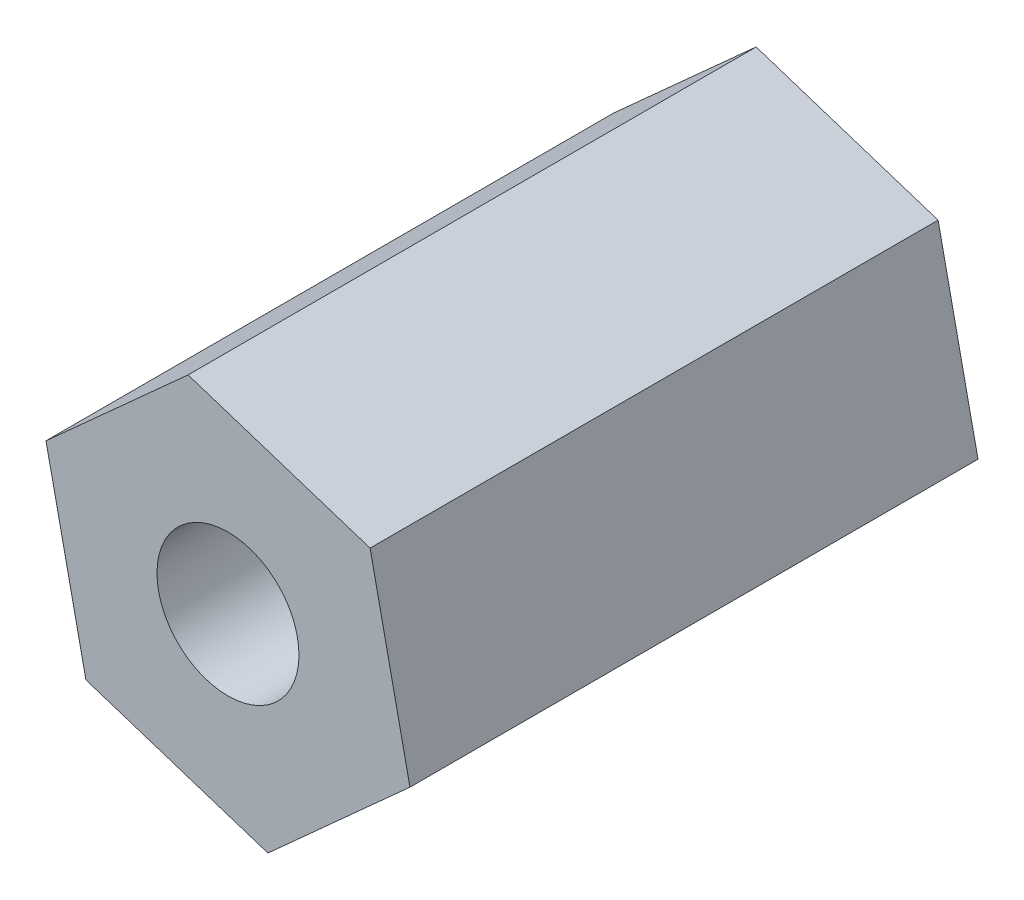
ISO-10303-21;
HEADER;
FILE_DESCRIPTION(('STEP AP214'),'2;1');
FILE_NAME('part.step','',(''),(''),'','','');
FILE_SCHEMA(('AUTOMOTIVE_DESIGN { 1 0 10303 214 1 1 1 1 }'));
ENDSEC;
DATA;
#1=APPLICATION_CONTEXT('core data for automotive mechanical design processes');
#2=APPLICATION_PROTOCOL_DEFINITION('international standard','automotive_design',2000,#1);
#3=PRODUCT_CONTEXT('',#1,'mechanical');
#4=PRODUCT('Part','Part','',(#3));
#5=PRODUCT_RELATED_PRODUCT_CATEGORY('part','',(#4));
#6=PRODUCT_DEFINITION_FORMATION('','',#4);
#7=PRODUCT_DEFINITION_CONTEXT('part definition',#1,'design');
#8=PRODUCT_DEFINITION('design','',#6,#7);
#9=PRODUCT_DEFINITION_SHAPE('','',#8);
#10=(LENGTH_UNIT() NAMED_UNIT(*) SI_UNIT(.MILLI.,.METRE.));
#11=(NAMED_UNIT(*) PLANE_ANGLE_UNIT() SI_UNIT($,.RADIAN.));
#12=(NAMED_UNIT(*) SI_UNIT($,.STERADIAN.) SOLID_ANGLE_UNIT());
#13=UNCERTAINTY_MEASURE_WITH_UNIT(LENGTH_MEASURE(1.E-05),#10,'distance_accuracy_value','');
#14=(GEOMETRIC_REPRESENTATION_CONTEXT(3) GLOBAL_UNCERTAINTY_ASSIGNED_CONTEXT((#13)) GLOBAL_UNIT_ASSIGNED_CONTEXT((#10,
#11,#12)) REPRESENTATION_CONTEXT('',''));
#15=CARTESIAN_POINT('',(0.,0.,0.));
#16=DIRECTION('',(0.,0.,1.));
#17=DIRECTION('',(1.,0.,0.));
#18=AXIS2_PLACEMENT_3D('',#15,#16,#17);
#19=CARTESIAN_POINT('',(3.00166839393673,2.70616337019305,12.));
#20=DIRECTION('',(-0.308413766503858,-0.95125230545366,0.));
#21=DIRECTION('',(0.95125230545366,-0.308413766503858,0.));
#22=AXIS2_PLACEMENT_3D('',#19,#20,#21);
#23=PLANE('',#22);
#24=DIRECTION('',(-0.95125230545366,0.308413766503858,0.));
#25=VECTOR('',#24,1.);
#26=CARTESIAN_POINT('',(3.00166839393673,2.70616337019305,0.));
#27=LINE('',#26,#25);
#28=CARTESIAN_POINT('',(3.00166839393673,2.70616337019305,0.));
#29=VERTEX_POINT('',#28);
#30=CARTESIAN_POINT('',(-0.842772028409732,3.95260276798257,0.));
#31=VERTEX_POINT('',#30);
#32=EDGE_CURVE('E117',#29,#31,#27,.T.);
#33=ORIENTED_EDGE('',*,*,#32,.T.);
#34=DIRECTION('',(0.,0.,-1.));
#35=VECTOR('',#34,1.);
#36=CARTESIAN_POINT('',(-0.842772028409732,3.95260276798257,12.));
#37=LINE('',#36,#35);
#38=CARTESIAN_POINT('',(-0.842772028409732,3.95260276798257,12.));
#39=VERTEX_POINT('',#38);
#40=EDGE_CURVE('E11',#39,#31,#37,.T.);
#41=ORIENTED_EDGE('',*,*,#40,.F.);
#42=DIRECTION('',(-0.95125230545366,0.308413766503858,0.));
#43=VECTOR('',#42,1.);
#44=CARTESIAN_POINT('',(3.00166839393673,2.70616337019305,12.));
#45=LINE('',#44,#43);
#46=CARTESIAN_POINT('',(3.00166839393673,2.70616337019305,12.));
#47=VERTEX_POINT('',#46);
#48=EDGE_CURVE('E128',#47,#39,#45,.T.);
#49=ORIENTED_EDGE('',*,*,#48,.F.);
#50=DIRECTION('',(0.,0.,-1.));
#51=VECTOR('',#50,1.);
#52=CARTESIAN_POINT('',(3.00166839393673,2.70616337019305,12.));
#53=LINE('',#52,#51);
#54=EDGE_CURVE('E113',#47,#29,#53,.T.);
#55=ORIENTED_EDGE('',*,*,#54,.T.);
#56=EDGE_LOOP('',(#33,#41,#49,#55));
#57=FACE_BOUND('',#56,.T.);
#58=ADVANCED_FACE('F33',(#57),#23,.F.);
#59=CARTESIAN_POINT('',(-0.842772028409732,3.95260276798257,12.));
#60=DIRECTION('',(0.669601778679456,-0.742720309396013,0.));
#61=DIRECTION('',(0.742720309396013,0.669601778679456,0.));
#62=AXIS2_PLACEMENT_3D('',#59,#60,#61);
#63=PLANE('',#62);
#64=DIRECTION('',(-0.742720309396013,-0.669601778679456,0.));
#65=VECTOR('',#64,1.);
#66=CARTESIAN_POINT('',(-0.842772028409732,3.95260276798257,0.));
#67=LINE('',#66,#65);
#68=CARTESIAN_POINT('',(-3.84444042234647,1.24643939778952,0.));
#69=VERTEX_POINT('',#68);
#70=EDGE_CURVE('E120',#31,#69,#67,.T.);
#71=ORIENTED_EDGE('',*,*,#70,.T.);
#72=DIRECTION('',(0.,0.,-1.));
#73=VECTOR('',#72,1.);
#74=CARTESIAN_POINT('',(-3.84444042234647,1.24643939778952,12.));
#75=LINE('',#74,#73);
#76=CARTESIAN_POINT('',(-3.84444042234647,1.24643939778952,12.));
#77=VERTEX_POINT('',#76);
#78=EDGE_CURVE('E41',#77,#69,#75,.T.);
#79=ORIENTED_EDGE('',*,*,#78,.F.);
#80=DIRECTION('',(-0.742720309396013,-0.669601778679456,0.));
#81=VECTOR('',#80,1.);
#82=CARTESIAN_POINT('',(-0.842772028409732,3.95260276798257,12.));
#83=LINE('',#82,#81);
#84=EDGE_CURVE('E86',#39,#77,#83,.T.);
#85=ORIENTED_EDGE('',*,*,#84,.F.);
#86=ORIENTED_EDGE('',*,*,#40,.T.);
#87=EDGE_LOOP('',(#71,#79,#85,#86));
#88=FACE_BOUND('',#87,.T.);
#89=ADVANCED_FACE('F153',(#88),#63,.F.);
#90=CARTESIAN_POINT('',(-3.84444042234647,1.24643939778952,12.));
#91=DIRECTION('',(0.978015545183313,0.208531996057647,0.));
#92=DIRECTION('',(-0.208531996057647,0.978015545183313,0.));
#93=AXIS2_PLACEMENT_3D('',#90,#91,#92);
#94=PLANE('',#93);
#95=DIRECTION('',(0.208531996057647,-0.978015545183313,0.));
#96=VECTOR('',#95,1.);
#97=CARTESIAN_POINT('',(-3.84444042234647,1.24643939778952,0.));
#98=LINE('',#97,#96);
#99=CARTESIAN_POINT('',(-3.00166839393674,-2.70616337019305,0.));
#100=VERTEX_POINT('',#99);
#101=EDGE_CURVE('E123',#69,#100,#98,.T.);
#102=ORIENTED_EDGE('',*,*,#101,.T.);
#103=DIRECTION('',(0.,0.,-1.));
#104=VECTOR('',#103,1.);
#105=CARTESIAN_POINT('',(-3.00166839393674,-2.70616337019305,12.));
#106=LINE('',#105,#104);
#107=CARTESIAN_POINT('',(-3.00166839393674,-2.70616337019305,12.));
#108=VERTEX_POINT('',#107);
#109=EDGE_CURVE('E108',#108,#100,#106,.T.);
#110=ORIENTED_EDGE('',*,*,#109,.F.);
#111=DIRECTION('',(0.208531996057647,-0.978015545183313,0.));
#112=VECTOR('',#111,1.);
#113=CARTESIAN_POINT('',(-3.84444042234647,1.24643939778952,12.));
#114=LINE('',#113,#112);
#115=EDGE_CURVE('E99',#77,#108,#114,.T.);
#116=ORIENTED_EDGE('',*,*,#115,.F.);
#117=ORIENTED_EDGE('',*,*,#78,.T.);
#118=EDGE_LOOP('',(#102,#110,#116,#117));
#119=FACE_BOUND('',#118,.T.);
#120=ADVANCED_FACE('F134',(#119),#94,.F.);
#121=CARTESIAN_POINT('',(-3.00166839393674,-2.70616337019305,12.));
#122=DIRECTION('',(0.308413766503858,0.95125230545366,0.));
#123=DIRECTION('',(-0.95125230545366,0.308413766503858,0.));
#124=AXIS2_PLACEMENT_3D('',#121,#122,#123);
#125=PLANE('',#124);
#126=DIRECTION('',(0.95125230545366,-0.308413766503858,0.));
#127=VECTOR('',#126,1.);
#128=CARTESIAN_POINT('',(-3.00166839393674,-2.70616337019305,0.));
#129=LINE('',#128,#127);
#130=CARTESIAN_POINT('',(0.842772028409723,-3.95260276798257,0.));
#131=VERTEX_POINT('',#130);
#132=EDGE_CURVE('E107',#100,#131,#129,.T.);
#133=ORIENTED_EDGE('',*,*,#132,.T.);
#134=DIRECTION('',(0.,0.,-1.));
#135=VECTOR('',#134,1.);
#136=CARTESIAN_POINT('',(0.842772028409723,-3.95260276798257,12.));
#137=LINE('',#136,#135);
#138=CARTESIAN_POINT('',(0.842772028409723,-3.95260276798257,12.));
#139=VERTEX_POINT('',#138);
#140=EDGE_CURVE('E104',#139,#131,#137,.T.);
#141=ORIENTED_EDGE('',*,*,#140,.F.);
#142=DIRECTION('',(0.95125230545366,-0.308413766503858,0.));
#143=VECTOR('',#142,1.);
#144=CARTESIAN_POINT('',(-3.00166839393674,-2.70616337019305,12.));
#145=LINE('',#144,#143);
#146=EDGE_CURVE('E93',#108,#139,#145,.T.);
#147=ORIENTED_EDGE('',*,*,#146,.F.);
#148=ORIENTED_EDGE('',*,*,#109,.T.);
#149=EDGE_LOOP('',(#133,#141,#147,#148));
#150=FACE_BOUND('',#149,.T.);
#151=ADVANCED_FACE('F105',(#150),#125,.F.);
#152=CARTESIAN_POINT('',(0.842772028409723,-3.95260276798257,12.));
#153=DIRECTION('',(-0.669601778679455,0.742720309396013,0.));
#154=DIRECTION('',(-0.742720309396013,-0.669601778679455,0.));
#155=AXIS2_PLACEMENT_3D('',#152,#153,#154);
#156=PLANE('',#155);
#157=DIRECTION('',(0.742720309396013,0.669601778679456,0.));
#158=VECTOR('',#157,1.);
#159=CARTESIAN_POINT('',(0.842772028409723,-3.95260276798257,0.));
#160=LINE('',#159,#158);
#161=CARTESIAN_POINT('',(3.84444042234646,-1.24643939778952,0.));
#162=VERTEX_POINT('',#161);
#163=EDGE_CURVE('E72',#131,#162,#160,.T.);
#164=ORIENTED_EDGE('',*,*,#163,.T.);
#165=DIRECTION('',(0.,0.,-1.));
#166=VECTOR('',#165,1.);
#167=CARTESIAN_POINT('',(3.84444042234646,-1.24643939778952,12.));
#168=LINE('',#167,#166);
#169=CARTESIAN_POINT('',(3.84444042234646,-1.24643939778952,12.));
#170=VERTEX_POINT('',#169);
#171=EDGE_CURVE('E109',#170,#162,#168,.T.);
#172=ORIENTED_EDGE('',*,*,#171,.F.);
#173=DIRECTION('',(0.742720309396013,0.669601778679456,0.));
#174=VECTOR('',#173,1.);
#175=CARTESIAN_POINT('',(0.842772028409723,-3.95260276798257,12.));
#176=LINE('',#175,#174);
#177=EDGE_CURVE('E97',#139,#170,#176,.T.);
#178=ORIENTED_EDGE('',*,*,#177,.F.);
#179=ORIENTED_EDGE('',*,*,#140,.T.);
#180=EDGE_LOOP('',(#164,#172,#178,#179));
#181=FACE_BOUND('',#180,.T.);
#182=ADVANCED_FACE('F111',(#181),#156,.F.);
#183=CARTESIAN_POINT('',(3.84444042234646,-1.24643939778952,12.));
#184=DIRECTION('',(-0.978015545183313,-0.208531996057647,0.));
#185=DIRECTION('',(0.208531996057647,-0.978015545183313,0.));
#186=AXIS2_PLACEMENT_3D('',#183,#184,#185);
#187=PLANE('',#186);
#188=DIRECTION('',(-0.208531996057647,0.978015545183313,0.));
#189=VECTOR('',#188,1.);
#190=CARTESIAN_POINT('',(3.84444042234646,-1.24643939778952,0.));
#191=LINE('',#190,#189);
#192=EDGE_CURVE('E78',#162,#29,#191,.T.);
#193=ORIENTED_EDGE('',*,*,#192,.T.);
#194=ORIENTED_EDGE('',*,*,#54,.F.);
#195=DIRECTION('',(-0.208531996057647,0.978015545183313,0.));
#196=VECTOR('',#195,1.);
#197=CARTESIAN_POINT('',(3.84444042234646,-1.24643939778952,12.));
#198=LINE('',#197,#196);
#199=EDGE_CURVE('E49',#170,#47,#198,.T.);
#200=ORIENTED_EDGE('',*,*,#199,.F.);
#201=ORIENTED_EDGE('',*,*,#171,.T.);
#202=EDGE_LOOP('',(#193,#194,#200,#201));
#203=FACE_BOUND('',#202,.T.);
#204=ADVANCED_FACE('F141',(#203),#187,.F.);
#205=CARTESIAN_POINT('',(0.,0.,12.));
#206=DIRECTION('',(0.,0.,1.));
#207=DIRECTION('',(1.,0.,0.));
#208=AXIS2_PLACEMENT_3D('',#205,#206,#207);
#209=PLANE('',#208);
#210=CARTESIAN_POINT('',(0.,0.,12.));
#211=DIRECTION('',(0.,0.,1.));
#212=DIRECTION('',(1.,0.,0.));
#213=AXIS2_PLACEMENT_3D('',#210,#211,#212);
#214=CIRCLE('',#213,1.5);
#215=CARTESIAN_POINT('',(1.5,0.,12.));
#216=VERTEX_POINT('',#215);
#217=EDGE_CURVE('E206',#216,#216,#214,.F.);
#218=ORIENTED_EDGE('',*,*,#217,.T.);
#219=EDGE_LOOP('',(#218));
#220=FACE_BOUND('',#219,.T.);
#221=ORIENTED_EDGE('',*,*,#48,.T.);
#222=ORIENTED_EDGE('',*,*,#84,.T.);
#223=ORIENTED_EDGE('',*,*,#115,.T.);
#224=ORIENTED_EDGE('',*,*,#146,.T.);
#225=ORIENTED_EDGE('',*,*,#177,.T.);
#226=ORIENTED_EDGE('',*,*,#199,.T.);
#227=EDGE_LOOP('',(#221,#222,#223,#224,#225,#226));
#228=FACE_BOUND('',#227,.T.);
#229=ADVANCED_FACE('F95',(#220,#228),#209,.T.);
#230=CARTESIAN_POINT('',(0.,0.,0.));
#231=DIRECTION('',(0.,0.,1.));
#232=DIRECTION('',(1.,0.,0.));
#233=AXIS2_PLACEMENT_3D('',#230,#231,#232);
#234=PLANE('',#233);
#235=CARTESIAN_POINT('',(0.,0.,0.));
#236=DIRECTION('',(0.,0.,-1.));
#237=DIRECTION('',(-1.,0.,0.));
#238=AXIS2_PLACEMENT_3D('',#235,#236,#237);
#239=CIRCLE('',#238,1.5);
#240=CARTESIAN_POINT('',(-1.5,0.,0.));
#241=VERTEX_POINT('',#240);
#242=EDGE_CURVE('E121',#241,#241,#239,.T.);
#243=ORIENTED_EDGE('',*,*,#242,.F.);
#244=EDGE_LOOP('',(#243));
#245=FACE_BOUND('',#244,.T.);
#246=ORIENTED_EDGE('',*,*,#32,.F.);
#247=ORIENTED_EDGE('',*,*,#192,.F.);
#248=ORIENTED_EDGE('',*,*,#163,.F.);
#249=ORIENTED_EDGE('',*,*,#132,.F.);
#250=ORIENTED_EDGE('',*,*,#101,.F.);
#251=ORIENTED_EDGE('',*,*,#70,.F.);
#252=EDGE_LOOP('',(#246,#247,#248,#249,#250,#251));
#253=FACE_BOUND('',#252,.T.);
#254=ADVANCED_FACE('F137',(#245,#253),#234,.F.);
#255=CARTESIAN_POINT('',(0.,0.,12.001));
#256=DIRECTION('',(0.,0.,-1.));
#257=DIRECTION('',(-1.,0.,0.));
#258=AXIS2_PLACEMENT_3D('',#255,#256,#257);
#259=CYLINDRICAL_SURFACE('',#258,1.5);
#260=ORIENTED_EDGE('',*,*,#217,.F.);
#261=EDGE_LOOP('',(#260));
#262=FACE_BOUND('',#261,.T.);
#263=ORIENTED_EDGE('',*,*,#242,.T.);
#264=EDGE_LOOP('',(#263));
#265=FACE_BOUND('',#264,.T.);
#266=ADVANCED_FACE('F190',(#262,#265),#259,.F.);
#267=CLOSED_SHELL('',(#58,#89,#120,#151,#182,#204,#229,#254,#266));
#268=MANIFOLD_SOLID_BREP('B2',#267);
#269=ADVANCED_BREP_SHAPE_REPRESENTATION('',(#18,#268),#14);
#270=SHAPE_DEFINITION_REPRESENTATION(#9,#269);
ENDSEC;
END-ISO-10303-21;
